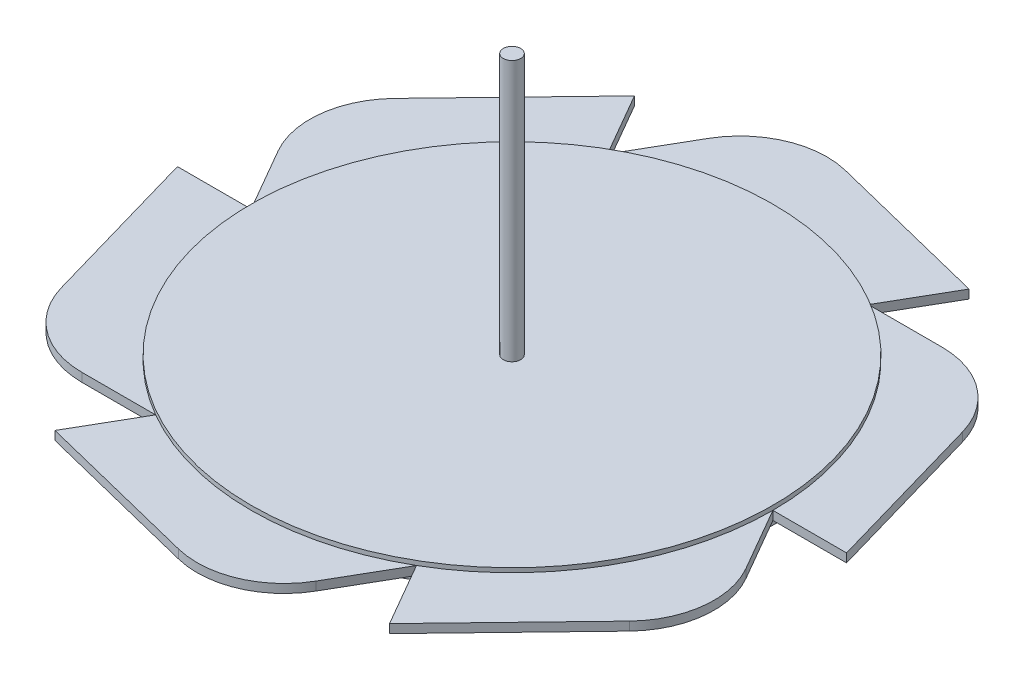
ISO-10303-21;
HEADER;
FILE_DESCRIPTION(('STEP AP214'),'2;1');
FILE_NAME('part.step','',(''),(''),'','','');
FILE_SCHEMA(('AUTOMOTIVE_DESIGN { 1 0 10303 214 1 1 1 1 }'));
ENDSEC;
DATA;
#1=APPLICATION_CONTEXT('core data for automotive mechanical design processes');
#2=APPLICATION_PROTOCOL_DEFINITION('international standard','automotive_design',2000,#1);
#3=PRODUCT_CONTEXT('',#1,'mechanical');
#4=PRODUCT('Part','Part','',(#3));
#5=PRODUCT_RELATED_PRODUCT_CATEGORY('part','',(#4));
#6=PRODUCT_DEFINITION_FORMATION('','',#4);
#7=PRODUCT_DEFINITION_CONTEXT('part definition',#1,'design');
#8=PRODUCT_DEFINITION('design','',#6,#7);
#9=PRODUCT_DEFINITION_SHAPE('','',#8);
#10=(LENGTH_UNIT() NAMED_UNIT(*) SI_UNIT(.MILLI.,.METRE.));
#11=(NAMED_UNIT(*) PLANE_ANGLE_UNIT() SI_UNIT($,.RADIAN.));
#12=(NAMED_UNIT(*) SI_UNIT($,.STERADIAN.) SOLID_ANGLE_UNIT());
#13=UNCERTAINTY_MEASURE_WITH_UNIT(LENGTH_MEASURE(1.E-05),#10,'distance_accuracy_value','');
#14=(GEOMETRIC_REPRESENTATION_CONTEXT(3) GLOBAL_UNCERTAINTY_ASSIGNED_CONTEXT((#13)) GLOBAL_UNIT_ASSIGNED_CONTEXT((#10,
#11,#12)) REPRESENTATION_CONTEXT('',''));
#15=CARTESIAN_POINT('',(0.,0.,0.));
#16=DIRECTION('',(0.,0.,1.));
#17=DIRECTION('',(1.,0.,0.));
#18=AXIS2_PLACEMENT_3D('',#15,#16,#17);
#19=CARTESIAN_POINT('',(0.,0.5,0.));
#20=DIRECTION('',(0.,-1.,0.));
#21=DIRECTION('',(0.,0.,-1.));
#22=AXIS2_PLACEMENT_3D('',#19,#20,#21);
#23=CYLINDRICAL_SURFACE('',#22,15.);
#24=CARTESIAN_POINT('',(0.,-0.5,0.));
#25=DIRECTION('',(0.,1.,0.));
#26=DIRECTION('',(0.,0.,1.));
#27=AXIS2_PLACEMENT_3D('',#24,#25,#26);
#28=CIRCLE('',#27,15.);
#29=CARTESIAN_POINT('',(0.,-0.5,15.));
#30=VERTEX_POINT('',#29);
#31=EDGE_CURVE('E137',#30,#30,#28,.T.);
#32=ORIENTED_EDGE('',*,*,#31,.T.);
#33=EDGE_LOOP('',(#32));
#34=FACE_BOUND('',#33,.T.);
#35=CARTESIAN_POINT('',(0.,-0.25,0.));
#36=DIRECTION('',(0.,1.,0.));
#37=DIRECTION('',(0.,0.,1.));
#38=AXIS2_PLACEMENT_3D('',#35,#36,#37);
#39=CIRCLE('',#38,15.);
#40=CARTESIAN_POINT('',(-7.50000000000011,-0.25,12.9903810567665));
#41=VERTEX_POINT('',#40);
#42=CARTESIAN_POINT('',(7.49999999999993,-0.25,12.9903810567666));
#43=VERTEX_POINT('',#42);
#44=EDGE_CURVE('E344',#41,#43,#39,.T.);
#45=ORIENTED_EDGE('',*,*,#44,.F.);
#46=CARTESIAN_POINT('',(0.,-0.25,0.));
#47=DIRECTION('',(0.,1.,0.));
#48=DIRECTION('',(0.,0.,1.));
#49=AXIS2_PLACEMENT_3D('',#46,#47,#48);
#50=CIRCLE('',#49,15.);
#51=CARTESIAN_POINT('',(-15.,-0.25,-1.67400815431762E-13));
#52=VERTEX_POINT('',#51);
#53=EDGE_CURVE('E512',#52,#41,#50,.T.);
#54=ORIENTED_EDGE('',*,*,#53,.F.);
#55=CARTESIAN_POINT('',(0.,-0.25,0.));
#56=DIRECTION('',(0.,1.,0.));
#57=DIRECTION('',(0.,0.,1.));
#58=AXIS2_PLACEMENT_3D('',#55,#56,#57);
#59=CIRCLE('',#58,15.);
#60=CARTESIAN_POINT('',(-7.50000000000002,-0.25,-12.9903810567666));
#61=VERTEX_POINT('',#60);
#62=EDGE_CURVE('E148',#61,#52,#59,.T.);
#63=ORIENTED_EDGE('',*,*,#62,.F.);
#64=CARTESIAN_POINT('',(0.,-0.25,0.));
#65=DIRECTION('',(0.,1.,0.));
#66=DIRECTION('',(0.,0.,1.));
#67=AXIS2_PLACEMENT_3D('',#64,#65,#66);
#68=CIRCLE('',#67,15.);
#69=CARTESIAN_POINT('',(7.50000000000002,-0.25,-12.9903810567666));
#70=VERTEX_POINT('',#69);
#71=EDGE_CURVE('E440',#70,#61,#68,.T.);
#72=ORIENTED_EDGE('',*,*,#71,.F.);
#73=CARTESIAN_POINT('',(0.,-0.25,0.));
#74=DIRECTION('',(0.,1.,0.));
#75=DIRECTION('',(0.,0.,1.));
#76=AXIS2_PLACEMENT_3D('',#73,#74,#75);
#77=CIRCLE('',#76,15.);
#78=CARTESIAN_POINT('',(15.,-0.25,0.));
#79=VERTEX_POINT('',#78);
#80=EDGE_CURVE('E403',#79,#70,#77,.T.);
#81=ORIENTED_EDGE('',*,*,#80,.F.);
#82=CARTESIAN_POINT('',(0.,-0.25,0.));
#83=DIRECTION('',(0.,1.,0.));
#84=DIRECTION('',(0.,0.,1.));
#85=AXIS2_PLACEMENT_3D('',#82,#83,#84);
#86=CIRCLE('',#85,15.);
#87=EDGE_CURVE('E366',#43,#79,#86,.T.);
#88=ORIENTED_EDGE('',*,*,#87,.F.);
#89=EDGE_LOOP('',(#45,#54,#63,#72,#81,#88));
#90=FACE_BOUND('',#89,.T.);
#91=ADVANCED_FACE('F133',(#34,#90),#23,.T.);
#92=CARTESIAN_POINT('',(0.,0.25,0.));
#93=DIRECTION('',(0.,1.,0.));
#94=DIRECTION('',(0.,0.,1.));
#95=AXIS2_PLACEMENT_3D('',#92,#93,#94);
#96=CIRCLE('',#95,15.);
#97=CARTESIAN_POINT('',(-15.,0.25,-1.60461921527855E-13));
#98=VERTEX_POINT('',#97);
#99=CARTESIAN_POINT('',(-7.50000000000011,0.25,12.9903810567665));
#100=VERTEX_POINT('',#99);
#101=EDGE_CURVE('E501',#98,#100,#96,.T.);
#102=ORIENTED_EDGE('',*,*,#101,.T.);
#103=CARTESIAN_POINT('',(0.,0.25,0.));
#104=DIRECTION('',(0.,1.,0.));
#105=DIRECTION('',(0.,0.,1.));
#106=AXIS2_PLACEMENT_3D('',#103,#104,#105);
#107=CIRCLE('',#106,15.);
#108=CARTESIAN_POINT('',(7.49999999999993,0.25,12.9903810567666));
#109=VERTEX_POINT('',#108);
#110=EDGE_CURVE('E313',#100,#109,#107,.T.);
#111=ORIENTED_EDGE('',*,*,#110,.T.);
#112=CARTESIAN_POINT('',(0.,0.25,0.));
#113=DIRECTION('',(0.,1.,0.));
#114=DIRECTION('',(0.,0.,1.));
#115=AXIS2_PLACEMENT_3D('',#112,#113,#114);
#116=CIRCLE('',#115,15.);
#117=CARTESIAN_POINT('',(15.,0.25,0.));
#118=VERTEX_POINT('',#117);
#119=EDGE_CURVE('E353',#109,#118,#116,.T.);
#120=ORIENTED_EDGE('',*,*,#119,.T.);
#121=CARTESIAN_POINT('',(0.,0.25,0.));
#122=DIRECTION('',(0.,1.,0.));
#123=DIRECTION('',(0.,0.,1.));
#124=AXIS2_PLACEMENT_3D('',#121,#122,#123);
#125=CIRCLE('',#124,15.);
#126=CARTESIAN_POINT('',(7.50000000000002,0.25,-12.9903810567666));
#127=VERTEX_POINT('',#126);
#128=EDGE_CURVE('E388',#118,#127,#125,.T.);
#129=ORIENTED_EDGE('',*,*,#128,.T.);
#130=CARTESIAN_POINT('',(0.,0.25,0.));
#131=DIRECTION('',(0.,1.,0.));
#132=DIRECTION('',(0.,0.,1.));
#133=AXIS2_PLACEMENT_3D('',#130,#131,#132);
#134=CIRCLE('',#133,15.);
#135=CARTESIAN_POINT('',(-7.50000000000002,0.25,-12.9903810567666));
#136=VERTEX_POINT('',#135);
#137=EDGE_CURVE('E425',#127,#136,#134,.T.);
#138=ORIENTED_EDGE('',*,*,#137,.T.);
#139=CARTESIAN_POINT('',(0.,0.25,0.));
#140=DIRECTION('',(0.,1.,0.));
#141=DIRECTION('',(0.,0.,1.));
#142=AXIS2_PLACEMENT_3D('',#139,#140,#141);
#143=CIRCLE('',#142,15.);
#144=EDGE_CURVE('E462',#136,#98,#143,.T.);
#145=ORIENTED_EDGE('',*,*,#144,.T.);
#146=EDGE_LOOP('',(#102,#111,#120,#129,#138,#145));
#147=FACE_BOUND('',#146,.T.);
#148=CARTESIAN_POINT('',(0.,0.5,0.));
#149=DIRECTION('',(0.,1.,0.));
#150=DIRECTION('',(0.,0.,1.));
#151=AXIS2_PLACEMENT_3D('',#148,#149,#150);
#152=CIRCLE('',#151,15.);
#153=CARTESIAN_POINT('',(0.,0.5,15.));
#154=VERTEX_POINT('',#153);
#155=EDGE_CURVE('E12',#154,#154,#152,.T.);
#156=ORIENTED_EDGE('',*,*,#155,.F.);
#157=EDGE_LOOP('',(#156));
#158=FACE_BOUND('',#157,.T.);
#159=ADVANCED_FACE('F135',(#147,#158),#23,.T.);
#160=CARTESIAN_POINT('',(0.,0.5,0.));
#161=DIRECTION('',(0.,1.,0.));
#162=DIRECTION('',(0.,0.,1.));
#163=AXIS2_PLACEMENT_3D('',#160,#161,#162);
#164=PLANE('',#163);
#165=CARTESIAN_POINT('',(0.,0.5,0.));
#166=DIRECTION('',(0.,1.,0.));
#167=DIRECTION('',(0.,0.,1.));
#168=AXIS2_PLACEMENT_3D('',#165,#166,#167);
#169=CIRCLE('',#168,0.5);
#170=CARTESIAN_POINT('',(0.,0.5,0.5));
#171=VERTEX_POINT('',#170);
#172=EDGE_CURVE('E931',#171,#171,#169,.T.);
#173=ORIENTED_EDGE('',*,*,#172,.F.);
#174=EDGE_LOOP('',(#173));
#175=FACE_BOUND('',#174,.T.);
#176=ORIENTED_EDGE('',*,*,#155,.T.);
#177=EDGE_LOOP('',(#176));
#178=FACE_BOUND('',#177,.T.);
#179=ADVANCED_FACE('F538',(#175,#178),#164,.T.);
#180=CARTESIAN_POINT('',(0.,-0.5,0.));
#181=DIRECTION('',(0.,1.,0.));
#182=DIRECTION('',(0.,0.,1.));
#183=AXIS2_PLACEMENT_3D('',#180,#181,#182);
#184=PLANE('',#183);
#185=ORIENTED_EDGE('',*,*,#31,.F.);
#186=EDGE_LOOP('',(#185));
#187=FACE_BOUND('',#186,.T.);
#188=ADVANCED_FACE('F535',(#187),#184,.F.);
#189=CARTESIAN_POINT('',(-11.7350492004007,0.25,7.99038105676649));
#190=DIRECTION('',(0.,-1.,0.));
#191=DIRECTION('',(0.,0.,-1.));
#192=AXIS2_PLACEMENT_3D('',#189,#190,#191);
#193=CYLINDRICAL_SURFACE('',#192,5.);
#194=CARTESIAN_POINT('',(-11.7350492004007,-0.25,7.99038105676649));
#195=DIRECTION('',(0.,1.,0.));
#196=DIRECTION('',(0.,0.,1.));
#197=AXIS2_PLACEMENT_3D('',#194,#195,#196);
#198=CIRCLE('',#197,5.);
#199=CARTESIAN_POINT('',(-11.7350492004007,-0.25,12.9903810567665));
#200=VERTEX_POINT('',#199);
#201=CARTESIAN_POINT('',(-16.5403648108902,-0.25,9.37202568675845));
#202=VERTEX_POINT('',#201);
#203=EDGE_CURVE('E483',#200,#202,#198,.F.);
#204=ORIENTED_EDGE('',*,*,#203,.F.);
#205=DIRECTION('',(0.,-1.,0.));
#206=VECTOR('',#205,1.);
#207=CARTESIAN_POINT('',(-11.7350492004007,0.25,12.9903810567665));
#208=LINE('',#207,#206);
#209=CARTESIAN_POINT('',(-11.7350492004007,0.25,12.9903810567665));
#210=VERTEX_POINT('',#209);
#211=EDGE_CURVE('E175',#210,#200,#208,.T.);
#212=ORIENTED_EDGE('',*,*,#211,.F.);
#213=CARTESIAN_POINT('',(-11.7350492004007,0.25,7.99038105676649));
#214=DIRECTION('',(0.,1.,0.));
#215=DIRECTION('',(0.,0.,1.));
#216=AXIS2_PLACEMENT_3D('',#213,#214,#215);
#217=CIRCLE('',#216,5.);
#218=CARTESIAN_POINT('',(-16.5403648108902,0.25,9.37202568675845));
#219=VERTEX_POINT('',#218);
#220=EDGE_CURVE('E495',#210,#219,#217,.F.);
#221=ORIENTED_EDGE('',*,*,#220,.T.);
#222=DIRECTION('',(0.,-1.,0.));
#223=VECTOR('',#222,1.);
#224=CARTESIAN_POINT('',(-16.5403648108902,0.25,9.37202568675845));
#225=LINE('',#224,#223);
#226=EDGE_CURVE('E157',#219,#202,#225,.T.);
#227=ORIENTED_EDGE('',*,*,#226,.T.);
#228=EDGE_LOOP('',(#204,#212,#221,#227));
#229=FACE_BOUND('',#228,.T.);
#230=ADVANCED_FACE('F537',(#229),#193,.T.);
#231=CARTESIAN_POINT('',(0.,0.25,12.9903810567666));
#232=DIRECTION('',(0.,0.,1.));
#233=DIRECTION('',(1.,0.,0.));
#234=AXIS2_PLACEMENT_3D('',#231,#232,#233);
#235=PLANE('',#234);
#236=DIRECTION('',(-1.,0.,0.));
#237=VECTOR('',#236,1.);
#238=CARTESIAN_POINT('',(0.,-0.25,12.9903810567666));
#239=LINE('',#238,#237);
#240=EDGE_CURVE('E509',#41,#200,#239,.T.);
#241=ORIENTED_EDGE('',*,*,#240,.F.);
#242=DIRECTION('',(0.,-1.,0.));
#243=VECTOR('',#242,1.);
#244=CARTESIAN_POINT('',(-7.50000000000011,0.25,12.9903810567665));
#245=LINE('',#244,#243);
#246=EDGE_CURVE('E526',#100,#41,#245,.T.);
#247=ORIENTED_EDGE('',*,*,#246,.F.);
#248=DIRECTION('',(-1.,0.,0.));
#249=VECTOR('',#248,1.);
#250=CARTESIAN_POINT('',(0.,0.25,12.9903810567666));
#251=LINE('',#250,#249);
#252=EDGE_CURVE('E497',#100,#210,#251,.T.);
#253=ORIENTED_EDGE('',*,*,#252,.T.);
#254=ORIENTED_EDGE('',*,*,#211,.T.);
#255=EDGE_LOOP('',(#241,#247,#253,#254));
#256=FACE_BOUND('',#255,.T.);
#257=ADVANCED_FACE('F543',(#256),#235,.T.);
#258=CARTESIAN_POINT('',(0.,0.25,-1.08236496811154E-13));
#259=DIRECTION('',(0.,0.,1.));
#260=DIRECTION('',(1.,0.,0.));
#261=AXIS2_PLACEMENT_3D('',#258,#259,#260);
#262=PLANE('',#261);
#263=DIRECTION('',(-1.,0.,0.));
#264=VECTOR('',#263,1.);
#265=CARTESIAN_POINT('',(0.,-0.25,-1.08236496811154E-13));
#266=LINE('',#265,#264);
#267=CARTESIAN_POINT('',(-19.2350492004006,-0.25,-1.74339709335669E-13));
#268=VERTEX_POINT('',#267);
#269=EDGE_CURVE('E515',#52,#268,#266,.T.);
#270=ORIENTED_EDGE('',*,*,#269,.T.);
#271=DIRECTION('',(0.,-1.,0.));
#272=VECTOR('',#271,1.);
#273=CARTESIAN_POINT('',(-19.2350492004006,0.25,-1.74339709335669E-13));
#274=LINE('',#273,#272);
#275=CARTESIAN_POINT('',(-19.2350492004006,0.25,-1.74339709335669E-13));
#276=VERTEX_POINT('',#275);
#277=EDGE_CURVE('E521',#276,#268,#274,.T.);
#278=ORIENTED_EDGE('',*,*,#277,.F.);
#279=DIRECTION('',(-1.,0.,0.));
#280=VECTOR('',#279,1.);
#281=CARTESIAN_POINT('',(0.,0.25,-1.08236496811154E-13));
#282=LINE('',#281,#280);
#283=EDGE_CURVE('E504',#98,#276,#282,.T.);
#284=ORIENTED_EDGE('',*,*,#283,.F.);
#285=DIRECTION('',(0.,-1.,0.));
#286=VECTOR('',#285,1.);
#287=CARTESIAN_POINT('',(-15.,0.25,-1.60461921527855E-13));
#288=LINE('',#287,#286);
#289=EDGE_CURVE('E523',#98,#52,#288,.T.);
#290=ORIENTED_EDGE('',*,*,#289,.T.);
#291=EDGE_LOOP('',(#270,#278,#284,#290));
#292=FACE_BOUND('',#291,.T.);
#293=ADVANCED_FACE('F576',(#292),#262,.F.);
#294=CARTESIAN_POINT('',(-17.7663055583416,0.25,5.10824317468259));
#295=DIRECTION('',(-0.961063122097906,0.,0.276328925998391));
#296=DIRECTION('',(0.276328925998391,0.,0.961063122097907));
#297=AXIS2_PLACEMENT_3D('',#294,#295,#296);
#298=PLANE('',#297);
#299=DIRECTION('',(-0.276328925998391,0.,-0.961063122097907));
#300=VECTOR('',#299,1.);
#301=CARTESIAN_POINT('',(-17.7663055583416,-0.25,5.10824317468259));
#302=LINE('',#301,#300);
#303=EDGE_CURVE('E498',#202,#268,#302,.T.);
#304=ORIENTED_EDGE('',*,*,#303,.F.);
#305=ORIENTED_EDGE('',*,*,#226,.F.);
#306=DIRECTION('',(-0.276328925998391,0.,-0.961063122097907));
#307=VECTOR('',#306,1.);
#308=CARTESIAN_POINT('',(-17.7663055583416,0.25,5.10824317468259));
#309=LINE('',#308,#307);
#310=EDGE_CURVE('E506',#219,#276,#309,.T.);
#311=ORIENTED_EDGE('',*,*,#310,.T.);
#312=ORIENTED_EDGE('',*,*,#277,.T.);
#313=EDGE_LOOP('',(#304,#305,#311,#312));
#314=FACE_BOUND('',#313,.T.);
#315=ADVANCED_FACE('F607',(#314),#298,.T.);
#316=CARTESIAN_POINT('',(0.,0.25,0.));
#317=DIRECTION('',(0.,1.,0.));
#318=DIRECTION('',(0.,0.,1.));
#319=AXIS2_PLACEMENT_3D('',#316,#317,#318);
#320=PLANE('',#319);
#321=ORIENTED_EDGE('',*,*,#220,.F.);
#322=ORIENTED_EDGE('',*,*,#252,.F.);
#323=ORIENTED_EDGE('',*,*,#101,.F.);
#324=ORIENTED_EDGE('',*,*,#283,.T.);
#325=ORIENTED_EDGE('',*,*,#310,.F.);
#326=EDGE_LOOP('',(#321,#322,#323,#324,#325));
#327=FACE_BOUND('',#326,.T.);
#328=ADVANCED_FACE('F566',(#327),#320,.T.);
#329=CARTESIAN_POINT('',(0.,-0.25,0.));
#330=DIRECTION('',(0.,1.,0.));
#331=DIRECTION('',(0.,0.,1.));
#332=AXIS2_PLACEMENT_3D('',#329,#330,#331);
#333=PLANE('',#332);
#334=ORIENTED_EDGE('',*,*,#203,.T.);
#335=ORIENTED_EDGE('',*,*,#303,.T.);
#336=ORIENTED_EDGE('',*,*,#269,.F.);
#337=ORIENTED_EDGE('',*,*,#53,.T.);
#338=ORIENTED_EDGE('',*,*,#240,.T.);
#339=EDGE_LOOP('',(#334,#335,#336,#337,#338));
#340=FACE_BOUND('',#339,.T.);
#341=ADVANCED_FACE('F569',(#340),#333,.F.);
#342=CARTESIAN_POINT('',(-12.787397581278,0.25,-6.16766019382403));
#343=DIRECTION('',(0.,-1.,0.));
#344=DIRECTION('',(0.,0.,-1.));
#345=AXIS2_PLACEMENT_3D('',#342,#343,#344);
#346=CYLINDRICAL_SURFACE('',#345,5.);
#347=CARTESIAN_POINT('',(-12.787397581278,-0.25,-6.16766019382403));
#348=DIRECTION('',(0.,1.,0.));
#349=DIRECTION('',(0.,0.,1.));
#350=AXIS2_PLACEMENT_3D('',#347,#348,#349);
#351=CIRCLE('',#350,5.);
#352=CARTESIAN_POINT('',(-17.1175246002003,-0.25,-3.66766019382407));
#353=VERTEX_POINT('',#352);
#354=CARTESIAN_POINT('',(-16.3865947350982,-0.25,-9.63836327071393));
#355=VERTEX_POINT('',#354);
#356=EDGE_CURVE('E477',#353,#355,#351,.F.);
#357=ORIENTED_EDGE('',*,*,#356,.F.);
#358=DIRECTION('',(0.,-1.,0.));
#359=VECTOR('',#358,1.);
#360=CARTESIAN_POINT('',(-17.1175246002003,0.25,-3.66766019382407));
#361=LINE('',#360,#359);
#362=CARTESIAN_POINT('',(-17.1175246002003,0.25,-3.66766019382407));
#363=VERTEX_POINT('',#362);
#364=EDGE_CURVE('E460',#363,#353,#361,.T.);
#365=ORIENTED_EDGE('',*,*,#364,.F.);
#366=CARTESIAN_POINT('',(-12.787397581278,0.25,-6.16766019382403));
#367=DIRECTION('',(0.,1.,0.));
#368=DIRECTION('',(0.,0.,1.));
#369=AXIS2_PLACEMENT_3D('',#366,#367,#368);
#370=CIRCLE('',#369,5.);
#371=CARTESIAN_POINT('',(-16.3865947350982,0.25,-9.63836327071393));
#372=VERTEX_POINT('',#371);
#373=EDGE_CURVE('E448',#363,#372,#370,.F.);
#374=ORIENTED_EDGE('',*,*,#373,.T.);
#375=DIRECTION('',(0.,-1.,0.));
#376=VECTOR('',#375,1.);
#377=CARTESIAN_POINT('',(-16.3865947350982,0.25,-9.63836327071393));
#378=LINE('',#377,#376);
#379=EDGE_CURVE('E472',#372,#355,#378,.T.);
#380=ORIENTED_EDGE('',*,*,#379,.T.);
#381=EDGE_LOOP('',(#357,#365,#374,#380));
#382=FACE_BOUND('',#381,.T.);
#383=ADVANCED_FACE('F587',(#382),#346,.T.);
#384=CARTESIAN_POINT('',(-11.25,0.25,6.49519052838319));
#385=DIRECTION('',(-0.866025403784442,0.,0.499999999999994));
#386=DIRECTION('',(0.499999999999994,0.,0.866025403784442));
#387=AXIS2_PLACEMENT_3D('',#384,#385,#386);
#388=PLANE('',#387);
#389=DIRECTION('',(-0.499999999999994,0.,-0.866025403784442));
#390=VECTOR('',#389,1.);
#391=CARTESIAN_POINT('',(-11.25,-0.25,6.49519052838319));
#392=LINE('',#391,#390);
#393=EDGE_CURVE('E481',#52,#353,#392,.T.);
#394=ORIENTED_EDGE('',*,*,#393,.F.);
#395=ORIENTED_EDGE('',*,*,#289,.F.);
#396=DIRECTION('',(-0.499999999999994,0.,-0.866025403784442));
#397=VECTOR('',#396,1.);
#398=CARTESIAN_POINT('',(-11.25,0.25,6.49519052838319));
#399=LINE('',#398,#397);
#400=EDGE_CURVE('E463',#98,#363,#399,.T.);
#401=ORIENTED_EDGE('',*,*,#400,.T.);
#402=ORIENTED_EDGE('',*,*,#364,.T.);
#403=EDGE_LOOP('',(#394,#395,#401,#402));
#404=FACE_BOUND('',#403,.T.);
#405=ADVANCED_FACE('F580',(#404),#388,.T.);
#406=CARTESIAN_POINT('',(0.,0.25,0.));
#407=DIRECTION('',(-0.866025403784442,0.,0.499999999999995));
#408=DIRECTION('',(0.499999999999995,0.,0.866025403784442));
#409=AXIS2_PLACEMENT_3D('',#406,#407,#408);
#410=PLANE('',#409);
#411=DIRECTION('',(-0.499999999999994,0.,-0.866025403784442));
#412=VECTOR('',#411,1.);
#413=CARTESIAN_POINT('',(0.,-0.25,0.));
#414=LINE('',#413,#412);
#415=CARTESIAN_POINT('',(-9.61752460020011,-0.25,-16.6580412505906));
#416=VERTEX_POINT('',#415);
#417=EDGE_CURVE('E468',#61,#416,#414,.T.);
#418=ORIENTED_EDGE('',*,*,#417,.T.);
#419=DIRECTION('',(0.,-1.,0.));
#420=VECTOR('',#419,1.);
#421=CARTESIAN_POINT('',(-9.61752460020011,0.25,-16.6580412505906));
#422=LINE('',#421,#420);
#423=CARTESIAN_POINT('',(-9.61752460020011,0.25,-16.6580412505906));
#424=VERTEX_POINT('',#423);
#425=EDGE_CURVE('E469',#424,#416,#422,.T.);
#426=ORIENTED_EDGE('',*,*,#425,.F.);
#427=DIRECTION('',(-0.499999999999994,0.,-0.866025403784442));
#428=VECTOR('',#427,1.);
#429=CARTESIAN_POINT('',(0.,0.25,0.));
#430=LINE('',#429,#428);
#431=EDGE_CURVE('E471',#136,#424,#430,.T.);
#432=ORIENTED_EDGE('',*,*,#431,.F.);
#433=DIRECTION('',(0.,-1.,0.));
#434=VECTOR('',#433,1.);
#435=CARTESIAN_POINT('',(-7.50000000000002,0.25,-12.9903810567666));
#436=LINE('',#435,#434);
#437=EDGE_CURVE('E464',#136,#61,#436,.T.);
#438=ORIENTED_EDGE('',*,*,#437,.T.);
#439=EDGE_LOOP('',(#418,#426,#432,#438));
#440=FACE_BOUND('',#439,.T.);
#441=ADVANCED_FACE('F653',(#440),#410,.F.);
#442=CARTESIAN_POINT('',(-13.3070211371543,0.25,-12.8319503575792));
#443=DIRECTION('',(-0.719839430764029,0.,-0.694140615377979));
#444=DIRECTION('',(-0.694140615377979,0.,0.719839430764029));
#445=AXIS2_PLACEMENT_3D('',#442,#443,#444);
#446=PLANE('',#445);
#447=DIRECTION('',(0.694140615377979,0.,-0.719839430764029));
#448=VECTOR('',#447,1.);
#449=CARTESIAN_POINT('',(-13.3070211371543,-0.25,-12.8319503575792));
#450=LINE('',#449,#448);
#451=EDGE_CURVE('E474',#355,#416,#450,.T.);
#452=ORIENTED_EDGE('',*,*,#451,.F.);
#453=ORIENTED_EDGE('',*,*,#379,.F.);
#454=DIRECTION('',(0.694140615377979,0.,-0.719839430764029));
#455=VECTOR('',#454,1.);
#456=CARTESIAN_POINT('',(-13.3070211371543,0.25,-12.8319503575792));
#457=LINE('',#456,#455);
#458=EDGE_CURVE('E467',#372,#424,#457,.T.);
#459=ORIENTED_EDGE('',*,*,#458,.T.);
#460=ORIENTED_EDGE('',*,*,#425,.T.);
#461=EDGE_LOOP('',(#452,#453,#459,#460));
#462=FACE_BOUND('',#461,.T.);
#463=ADVANCED_FACE('F600',(#462),#446,.T.);
#464=CARTESIAN_POINT('',(0.,0.25,0.));
#465=DIRECTION('',(0.,1.,0.));
#466=DIRECTION('',(0.,0.,1.));
#467=AXIS2_PLACEMENT_3D('',#464,#465,#466);
#468=PLANE('',#467);
#469=ORIENTED_EDGE('',*,*,#373,.F.);
#470=ORIENTED_EDGE('',*,*,#400,.F.);
#471=ORIENTED_EDGE('',*,*,#144,.F.);
#472=ORIENTED_EDGE('',*,*,#431,.T.);
#473=ORIENTED_EDGE('',*,*,#458,.F.);
#474=EDGE_LOOP('',(#469,#470,#471,#472,#473));
#475=FACE_BOUND('',#474,.T.);
#476=ADVANCED_FACE('F583',(#475),#468,.T.);
#477=CARTESIAN_POINT('',(0.,-0.25,0.));
#478=DIRECTION('',(0.,1.,0.));
#479=DIRECTION('',(0.,0.,1.));
#480=AXIS2_PLACEMENT_3D('',#477,#478,#479);
#481=PLANE('',#480);
#482=ORIENTED_EDGE('',*,*,#356,.T.);
#483=ORIENTED_EDGE('',*,*,#451,.T.);
#484=ORIENTED_EDGE('',*,*,#417,.F.);
#485=ORIENTED_EDGE('',*,*,#62,.T.);
#486=ORIENTED_EDGE('',*,*,#393,.T.);
#487=EDGE_LOOP('',(#482,#483,#484,#485,#486));
#488=FACE_BOUND('',#487,.T.);
#489=ADVANCED_FACE('F589',(#488),#481,.F.);
#490=CARTESIAN_POINT('',(-1.05234838087752,0.25,-14.1580412505905));
#491=DIRECTION('',(0.,-1.,0.));
#492=DIRECTION('',(0.,0.,-1.));
#493=AXIS2_PLACEMENT_3D('',#490,#491,#492);
#494=CYLINDRICAL_SURFACE('',#493,5.);
#495=CARTESIAN_POINT('',(-1.05234838087752,-0.25,-14.1580412505905));
#496=DIRECTION('',(0.,1.,0.));
#497=DIRECTION('',(0.,0.,1.));
#498=AXIS2_PLACEMENT_3D('',#495,#496,#497);
#499=CIRCLE('',#498,5.);
#500=CARTESIAN_POINT('',(-5.38247539979972,-0.25,-16.6580412505905));
#501=VERTEX_POINT('',#500);
#502=CARTESIAN_POINT('',(0.153770075791809,-0.25,-19.0103889574723));
#503=VERTEX_POINT('',#502);
#504=EDGE_CURVE('E441',#501,#503,#499,.F.);
#505=ORIENTED_EDGE('',*,*,#504,.F.);
#506=DIRECTION('',(0.,-1.,0.));
#507=VECTOR('',#506,1.);
#508=CARTESIAN_POINT('',(-5.38247539979972,0.25,-16.6580412505905));
#509=LINE('',#508,#507);
#510=CARTESIAN_POINT('',(-5.38247539979972,0.25,-16.6580412505905));
#511=VERTEX_POINT('',#510);
#512=EDGE_CURVE('E423',#511,#501,#509,.T.);
#513=ORIENTED_EDGE('',*,*,#512,.F.);
#514=CARTESIAN_POINT('',(-1.05234838087752,0.25,-14.1580412505905));
#515=DIRECTION('',(0.,1.,0.));
#516=DIRECTION('',(0.,0.,1.));
#517=AXIS2_PLACEMENT_3D('',#514,#515,#516);
#518=CIRCLE('',#517,5.);
#519=CARTESIAN_POINT('',(0.153770075791809,0.25,-19.0103889574723));
#520=VERTEX_POINT('',#519);
#521=EDGE_CURVE('E411',#511,#520,#518,.F.);
#522=ORIENTED_EDGE('',*,*,#521,.T.);
#523=DIRECTION('',(0.,-1.,0.));
#524=VECTOR('',#523,1.);
#525=CARTESIAN_POINT('',(0.153770075791809,0.25,-19.0103889574723));
#526=LINE('',#525,#524);
#527=EDGE_CURVE('E435',#520,#503,#526,.T.);
#528=ORIENTED_EDGE('',*,*,#527,.T.);
#529=EDGE_LOOP('',(#505,#513,#522,#528));
#530=FACE_BOUND('',#529,.T.);
#531=ADVANCED_FACE('F591',(#530),#494,.T.);
#532=CARTESIAN_POINT('',(-11.25,0.25,-6.49519052838327));
#533=DIRECTION('',(-0.866025403784439,0.,-0.499999999999999));
#534=DIRECTION('',(-0.499999999999999,0.,0.866025403784439));
#535=AXIS2_PLACEMENT_3D('',#532,#533,#534);
#536=PLANE('',#535);
#537=DIRECTION('',(0.499999999999999,0.,-0.86602540378444));
#538=VECTOR('',#537,1.);
#539=CARTESIAN_POINT('',(-11.25,-0.25,-6.49519052838327));
#540=LINE('',#539,#538);
#541=EDGE_CURVE('E445',#61,#501,#540,.T.);
#542=ORIENTED_EDGE('',*,*,#541,.F.);
#543=ORIENTED_EDGE('',*,*,#437,.F.);
#544=DIRECTION('',(0.499999999999999,0.,-0.86602540378444));
#545=VECTOR('',#544,1.);
#546=CARTESIAN_POINT('',(-11.25,0.25,-6.49519052838327));
#547=LINE('',#546,#545);
#548=EDGE_CURVE('E426',#136,#511,#547,.T.);
#549=ORIENTED_EDGE('',*,*,#548,.T.);
#550=ORIENTED_EDGE('',*,*,#512,.T.);
#551=EDGE_LOOP('',(#542,#543,#549,#550));
#552=FACE_BOUND('',#551,.T.);
#553=ADVANCED_FACE('F597',(#552),#536,.T.);
#554=CARTESIAN_POINT('',(0.,0.25,0.));
#555=DIRECTION('',(-0.866025403784441,0.,-0.499999999999995));
#556=DIRECTION('',(-0.499999999999995,0.,0.866025403784442));
#557=AXIS2_PLACEMENT_3D('',#554,#555,#556);
#558=PLANE('',#557);
#559=DIRECTION('',(0.499999999999995,0.,-0.866025403784441));
#560=VECTOR('',#559,1.);
#561=CARTESIAN_POINT('',(0.,-0.25,0.));
#562=LINE('',#561,#560);
#563=CARTESIAN_POINT('',(9.6175246002003,-0.25,-16.6580412505905));
#564=VERTEX_POINT('',#563);
#565=EDGE_CURVE('E431',#70,#564,#562,.T.);
#566=ORIENTED_EDGE('',*,*,#565,.T.);
#567=DIRECTION('',(0.,-1.,0.));
#568=VECTOR('',#567,1.);
#569=CARTESIAN_POINT('',(9.6175246002003,0.25,-16.6580412505905));
#570=LINE('',#569,#568);
#571=CARTESIAN_POINT('',(9.6175246002003,0.25,-16.6580412505905));
#572=VERTEX_POINT('',#571);
#573=EDGE_CURVE('E432',#572,#564,#570,.T.);
#574=ORIENTED_EDGE('',*,*,#573,.F.);
#575=DIRECTION('',(0.499999999999995,0.,-0.866025403784441));
#576=VECTOR('',#575,1.);
#577=CARTESIAN_POINT('',(0.,0.25,0.));
#578=LINE('',#577,#576);
#579=EDGE_CURVE('E434',#127,#572,#578,.T.);
#580=ORIENTED_EDGE('',*,*,#579,.F.);
#581=DIRECTION('',(0.,-1.,0.));
#582=VECTOR('',#581,1.);
#583=CARTESIAN_POINT('',(7.50000000000002,0.25,-12.9903810567666));
#584=LINE('',#583,#582);
#585=EDGE_CURVE('E427',#127,#70,#584,.T.);
#586=ORIENTED_EDGE('',*,*,#585,.T.);
#587=EDGE_LOOP('',(#566,#574,#580,#586));
#588=FACE_BOUND('',#587,.T.);
#589=ADVANCED_FACE('F693',(#588),#558,.F.);
#590=CARTESIAN_POINT('',(4.45928442118702,0.25,-17.9401935322618));
#591=DIRECTION('',(0.241223691333867,0.,-0.970469541376371));
#592=DIRECTION('',(-0.970469541376371,0.,-0.241223691333867));
#593=AXIS2_PLACEMENT_3D('',#590,#591,#592);
#594=PLANE('',#593);
#595=DIRECTION('',(0.970469541376371,0.,0.241223691333867));
#596=VECTOR('',#595,1.);
#597=CARTESIAN_POINT('',(4.45928442118702,-0.25,-17.9401935322618));
#598=LINE('',#597,#596);
#599=EDGE_CURVE('E437',#503,#564,#598,.T.);
#600=ORIENTED_EDGE('',*,*,#599,.F.);
#601=ORIENTED_EDGE('',*,*,#527,.F.);
#602=DIRECTION('',(0.970469541376371,0.,0.241223691333867));
#603=VECTOR('',#602,1.);
#604=CARTESIAN_POINT('',(4.45928442118702,0.25,-17.9401935322618));
#605=LINE('',#604,#603);
#606=EDGE_CURVE('E430',#520,#572,#605,.T.);
#607=ORIENTED_EDGE('',*,*,#606,.T.);
#608=ORIENTED_EDGE('',*,*,#573,.T.);
#609=EDGE_LOOP('',(#600,#601,#607,#608));
#610=FACE_BOUND('',#609,.T.);
#611=ADVANCED_FACE('F703',(#610),#594,.T.);
#612=CARTESIAN_POINT('',(0.,0.25,0.));
#613=DIRECTION('',(0.,1.,0.));
#614=DIRECTION('',(0.,0.,1.));
#615=AXIS2_PLACEMENT_3D('',#612,#613,#614);
#616=PLANE('',#615);
#617=ORIENTED_EDGE('',*,*,#521,.F.);
#618=ORIENTED_EDGE('',*,*,#548,.F.);
#619=ORIENTED_EDGE('',*,*,#137,.F.);
#620=ORIENTED_EDGE('',*,*,#579,.T.);
#621=ORIENTED_EDGE('',*,*,#606,.F.);
#622=EDGE_LOOP('',(#617,#618,#619,#620,#621));
#623=FACE_BOUND('',#622,.T.);
#624=ADVANCED_FACE('F713',(#623),#616,.T.);
#625=CARTESIAN_POINT('',(0.,-0.25,0.));
#626=DIRECTION('',(0.,1.,0.));
#627=DIRECTION('',(0.,0.,1.));
#628=AXIS2_PLACEMENT_3D('',#625,#626,#627);
#629=PLANE('',#628);
#630=ORIENTED_EDGE('',*,*,#504,.T.);
#631=ORIENTED_EDGE('',*,*,#599,.T.);
#632=ORIENTED_EDGE('',*,*,#565,.F.);
#633=ORIENTED_EDGE('',*,*,#71,.T.);
#634=ORIENTED_EDGE('',*,*,#541,.T.);
#635=EDGE_LOOP('',(#630,#631,#632,#633,#634));
#636=FACE_BOUND('',#635,.T.);
#637=ADVANCED_FACE('F723',(#636),#629,.F.);
#638=CARTESIAN_POINT('',(11.7350492004006,0.25,-7.99038105676657));
#639=DIRECTION('',(0.,-1.,0.));
#640=DIRECTION('',(0.,0.,-1.));
#641=AXIS2_PLACEMENT_3D('',#638,#639,#640);
#642=CYLINDRICAL_SURFACE('',#641,5.);
#643=CARTESIAN_POINT('',(11.7350492004006,-0.25,-7.99038105676657));
#644=DIRECTION('',(0.,1.,0.));
#645=DIRECTION('',(0.,0.,1.));
#646=AXIS2_PLACEMENT_3D('',#643,#644,#645);
#647=CIRCLE('',#646,5.);
#648=CARTESIAN_POINT('',(11.7350492004006,-0.25,-12.9903810567666));
#649=VERTEX_POINT('',#648);
#650=CARTESIAN_POINT('',(16.5403648108901,-0.25,-9.37202568675857));
#651=VERTEX_POINT('',#650);
#652=EDGE_CURVE('E404',#649,#651,#647,.F.);
#653=ORIENTED_EDGE('',*,*,#652,.F.);
#654=DIRECTION('',(0.,-1.,0.));
#655=VECTOR('',#654,1.);
#656=CARTESIAN_POINT('',(11.7350492004006,0.25,-12.9903810567666));
#657=LINE('',#656,#655);
#658=CARTESIAN_POINT('',(11.7350492004006,0.25,-12.9903810567666));
#659=VERTEX_POINT('',#658);
#660=EDGE_CURVE('E386',#659,#649,#657,.T.);
#661=ORIENTED_EDGE('',*,*,#660,.F.);
#662=CARTESIAN_POINT('',(11.7350492004006,0.25,-7.99038105676657));
#663=DIRECTION('',(0.,1.,0.));
#664=DIRECTION('',(0.,0.,1.));
#665=AXIS2_PLACEMENT_3D('',#662,#663,#664);
#666=CIRCLE('',#665,5.);
#667=CARTESIAN_POINT('',(16.5403648108901,0.25,-9.37202568675857));
#668=VERTEX_POINT('',#667);
#669=EDGE_CURVE('E374',#659,#668,#666,.F.);
#670=ORIENTED_EDGE('',*,*,#669,.T.);
#671=DIRECTION('',(0.,-1.,0.));
#672=VECTOR('',#671,1.);
#673=CARTESIAN_POINT('',(16.5403648108901,0.25,-9.37202568675857));
#674=LINE('',#673,#672);
#675=EDGE_CURVE('E398',#668,#651,#674,.T.);
#676=ORIENTED_EDGE('',*,*,#675,.T.);
#677=EDGE_LOOP('',(#653,#661,#670,#676));
#678=FACE_BOUND('',#677,.T.);
#679=ADVANCED_FACE('F733',(#678),#642,.T.);
#680=CARTESIAN_POINT('',(0.,0.25,-12.9903810567666));
#681=DIRECTION('',(0.,0.,-1.));
#682=DIRECTION('',(-1.,0.,0.));
#683=AXIS2_PLACEMENT_3D('',#680,#681,#682);
#684=PLANE('',#683);
#685=DIRECTION('',(1.,0.,0.));
#686=VECTOR('',#685,1.);
#687=CARTESIAN_POINT('',(0.,-0.25,-12.9903810567666));
#688=LINE('',#687,#686);
#689=EDGE_CURVE('E408',#70,#649,#688,.T.);
#690=ORIENTED_EDGE('',*,*,#689,.F.);
#691=ORIENTED_EDGE('',*,*,#585,.F.);
#692=DIRECTION('',(1.,0.,0.));
#693=VECTOR('',#692,1.);
#694=CARTESIAN_POINT('',(0.,0.25,-12.9903810567666));
#695=LINE('',#694,#693);
#696=EDGE_CURVE('E389',#127,#659,#695,.T.);
#697=ORIENTED_EDGE('',*,*,#696,.T.);
#698=ORIENTED_EDGE('',*,*,#660,.T.);
#699=EDGE_LOOP('',(#690,#691,#697,#698));
#700=FACE_BOUND('',#699,.T.);
#701=ADVANCED_FACE('F743',(#700),#684,.T.);
#702=CARTESIAN_POINT('',(0.,0.25,1.04664492141093E-13));
#703=DIRECTION('',(0.,0.,-1.));
#704=DIRECTION('',(-1.,0.,0.));
#705=AXIS2_PLACEMENT_3D('',#702,#703,#704);
#706=PLANE('',#705);
#707=DIRECTION('',(1.,0.,0.));
#708=VECTOR('',#707,1.);
#709=CARTESIAN_POINT('',(0.,-0.25,1.04664492141093E-13));
#710=LINE('',#709,#708);
#711=CARTESIAN_POINT('',(19.2350492004006,-0.25,0.));
#712=VERTEX_POINT('',#711);
#713=EDGE_CURVE('E394',#79,#712,#710,.T.);
#714=ORIENTED_EDGE('',*,*,#713,.T.);
#715=DIRECTION('',(0.,-1.,0.));
#716=VECTOR('',#715,1.);
#717=CARTESIAN_POINT('',(19.2350492004006,0.25,0.));
#718=LINE('',#717,#716);
#719=CARTESIAN_POINT('',(19.2350492004006,0.25,0.));
#720=VERTEX_POINT('',#719);
#721=EDGE_CURVE('E395',#720,#712,#718,.T.);
#722=ORIENTED_EDGE('',*,*,#721,.F.);
#723=DIRECTION('',(1.,0.,0.));
#724=VECTOR('',#723,1.);
#725=CARTESIAN_POINT('',(0.,0.25,1.04664492141093E-13));
#726=LINE('',#725,#724);
#727=EDGE_CURVE('E397',#118,#720,#726,.T.);
#728=ORIENTED_EDGE('',*,*,#727,.F.);
#729=DIRECTION('',(0.,-1.,0.));
#730=VECTOR('',#729,1.);
#731=CARTESIAN_POINT('',(15.,0.25,0.));
#732=LINE('',#731,#730);
#733=EDGE_CURVE('E390',#118,#79,#732,.T.);
#734=ORIENTED_EDGE('',*,*,#733,.T.);
#735=EDGE_LOOP('',(#714,#722,#728,#734));
#736=FACE_BOUND('',#735,.T.);
#737=ADVANCED_FACE('F753',(#736),#706,.F.);
#738=CARTESIAN_POINT('',(17.7663055583415,0.25,-5.10824317468272));
#739=DIRECTION('',(0.961063122097905,0.,-0.276328925998398));
#740=DIRECTION('',(-0.276328925998398,0.,-0.961063122097905));
#741=AXIS2_PLACEMENT_3D('',#738,#739,#740);
#742=PLANE('',#741);
#743=DIRECTION('',(0.276328925998398,0.,0.961063122097905));
#744=VECTOR('',#743,1.);
#745=CARTESIAN_POINT('',(17.7663055583415,-0.25,-5.10824317468272));
#746=LINE('',#745,#744);
#747=EDGE_CURVE('E400',#651,#712,#746,.T.);
#748=ORIENTED_EDGE('',*,*,#747,.F.);
#749=ORIENTED_EDGE('',*,*,#675,.F.);
#750=DIRECTION('',(0.276328925998398,0.,0.961063122097905));
#751=VECTOR('',#750,1.);
#752=CARTESIAN_POINT('',(17.7663055583415,0.25,-5.10824317468272));
#753=LINE('',#752,#751);
#754=EDGE_CURVE('E393',#668,#720,#753,.T.);
#755=ORIENTED_EDGE('',*,*,#754,.T.);
#756=ORIENTED_EDGE('',*,*,#721,.T.);
#757=EDGE_LOOP('',(#748,#749,#755,#756));
#758=FACE_BOUND('',#757,.T.);
#759=ADVANCED_FACE('F763',(#758),#742,.T.);
#760=CARTESIAN_POINT('',(0.,0.25,0.));
#761=DIRECTION('',(0.,1.,0.));
#762=DIRECTION('',(0.,0.,1.));
#763=AXIS2_PLACEMENT_3D('',#760,#761,#762);
#764=PLANE('',#763);
#765=ORIENTED_EDGE('',*,*,#669,.F.);
#766=ORIENTED_EDGE('',*,*,#696,.F.);
#767=ORIENTED_EDGE('',*,*,#128,.F.);
#768=ORIENTED_EDGE('',*,*,#727,.T.);
#769=ORIENTED_EDGE('',*,*,#754,.F.);
#770=EDGE_LOOP('',(#765,#766,#767,#768,#769));
#771=FACE_BOUND('',#770,.T.);
#772=ADVANCED_FACE('F773',(#771),#764,.T.);
#773=CARTESIAN_POINT('',(0.,-0.25,0.));
#774=DIRECTION('',(0.,1.,0.));
#775=DIRECTION('',(0.,0.,1.));
#776=AXIS2_PLACEMENT_3D('',#773,#774,#775);
#777=PLANE('',#776);
#778=ORIENTED_EDGE('',*,*,#652,.T.);
#779=ORIENTED_EDGE('',*,*,#747,.T.);
#780=ORIENTED_EDGE('',*,*,#713,.F.);
#781=ORIENTED_EDGE('',*,*,#80,.T.);
#782=ORIENTED_EDGE('',*,*,#689,.T.);
#783=EDGE_LOOP('',(#778,#779,#780,#781,#782));
#784=FACE_BOUND('',#783,.T.);
#785=ADVANCED_FACE('F783',(#784),#777,.F.);
#786=CARTESIAN_POINT('',(12.7873975812781,0.25,6.16766019382394));
#787=DIRECTION('',(0.,-1.,0.));
#788=DIRECTION('',(0.,0.,-1.));
#789=AXIS2_PLACEMENT_3D('',#786,#787,#788);
#790=CYLINDRICAL_SURFACE('',#789,5.);
#791=CARTESIAN_POINT('',(12.7873975812781,-0.25,6.16766019382394));
#792=DIRECTION('',(0.,1.,0.));
#793=DIRECTION('',(0.,0.,1.));
#794=AXIS2_PLACEMENT_3D('',#791,#792,#793);
#795=CIRCLE('',#794,5.);
#796=CARTESIAN_POINT('',(17.1175246002003,-0.25,3.66766019382395));
#797=VERTEX_POINT('',#796);
#798=CARTESIAN_POINT('',(16.3865947350983,-0.25,9.63836327071381));
#799=VERTEX_POINT('',#798);
#800=EDGE_CURVE('E367',#797,#799,#795,.F.);
#801=ORIENTED_EDGE('',*,*,#800,.F.);
#802=DIRECTION('',(0.,-1.,0.));
#803=VECTOR('',#802,1.);
#804=CARTESIAN_POINT('',(17.1175246002003,0.25,3.66766019382395));
#805=LINE('',#804,#803);
#806=CARTESIAN_POINT('',(17.1175246002003,0.25,3.66766019382395));
#807=VERTEX_POINT('',#806);
#808=EDGE_CURVE('E351',#807,#797,#805,.T.);
#809=ORIENTED_EDGE('',*,*,#808,.F.);
#810=CARTESIAN_POINT('',(12.7873975812781,0.25,6.16766019382394));
#811=DIRECTION('',(0.,1.,0.));
#812=DIRECTION('',(0.,0.,1.));
#813=AXIS2_PLACEMENT_3D('',#810,#811,#812);
#814=CIRCLE('',#813,5.);
#815=CARTESIAN_POINT('',(16.3865947350983,0.25,9.63836327071381));
#816=VERTEX_POINT('',#815);
#817=EDGE_CURVE('E343',#807,#816,#814,.F.);
#818=ORIENTED_EDGE('',*,*,#817,.T.);
#819=DIRECTION('',(0.,-1.,0.));
#820=VECTOR('',#819,1.);
#821=CARTESIAN_POINT('',(16.3865947350983,0.25,9.63836327071381));
#822=LINE('',#821,#820);
#823=EDGE_CURVE('E361',#816,#799,#822,.T.);
#824=ORIENTED_EDGE('',*,*,#823,.T.);
#825=EDGE_LOOP('',(#801,#809,#818,#824));
#826=FACE_BOUND('',#825,.T.);
#827=ADVANCED_FACE('F793',(#826),#790,.T.);
#828=CARTESIAN_POINT('',(11.25,0.25,-6.49519052838327));
#829=DIRECTION('',(0.866025403784439,0.,-0.499999999999999));
#830=DIRECTION('',(-0.499999999999999,0.,-0.866025403784439));
#831=AXIS2_PLACEMENT_3D('',#828,#829,#830);
#832=PLANE('',#831);
#833=DIRECTION('',(0.5,0.,0.866025403784439));
#834=VECTOR('',#833,1.);
#835=CARTESIAN_POINT('',(11.25,-0.25,-6.49519052838327));
#836=LINE('',#835,#834);
#837=EDGE_CURVE('E371',#79,#797,#836,.T.);
#838=ORIENTED_EDGE('',*,*,#837,.F.);
#839=ORIENTED_EDGE('',*,*,#733,.F.);
#840=DIRECTION('',(0.5,0.,0.866025403784439));
#841=VECTOR('',#840,1.);
#842=CARTESIAN_POINT('',(11.25,0.25,-6.49519052838327));
#843=LINE('',#842,#841);
#844=EDGE_CURVE('E354',#118,#807,#843,.T.);
#845=ORIENTED_EDGE('',*,*,#844,.T.);
#846=ORIENTED_EDGE('',*,*,#808,.T.);
#847=EDGE_LOOP('',(#838,#839,#845,#846));
#848=FACE_BOUND('',#847,.T.);
#849=ADVANCED_FACE('F803',(#848),#832,.T.);
#850=CARTESIAN_POINT('',(0.,0.25,0.));
#851=DIRECTION('',(0.866025403784438,0.,-0.500000000000001));
#852=DIRECTION('',(-0.500000000000001,0.,-0.866025403784438));
#853=AXIS2_PLACEMENT_3D('',#850,#851,#852);
#854=PLANE('',#853);
#855=DIRECTION('',(0.500000000000001,0.,0.866025403784438));
#856=VECTOR('',#855,1.);
#857=CARTESIAN_POINT('',(0.,-0.25,0.));
#858=LINE('',#857,#856);
#859=CARTESIAN_POINT('',(9.61752460020023,-0.25,16.6580412505905));
#860=VERTEX_POINT('',#859);
#861=EDGE_CURVE('E357',#43,#860,#858,.T.);
#862=ORIENTED_EDGE('',*,*,#861,.T.);
#863=DIRECTION('',(0.,-1.,0.));
#864=VECTOR('',#863,1.);
#865=CARTESIAN_POINT('',(9.61752460020023,0.25,16.6580412505905));
#866=LINE('',#865,#864);
#867=CARTESIAN_POINT('',(9.61752460020023,0.25,16.6580412505905));
#868=VERTEX_POINT('',#867);
#869=EDGE_CURVE('E358',#868,#860,#866,.T.);
#870=ORIENTED_EDGE('',*,*,#869,.F.);
#871=DIRECTION('',(0.500000000000001,0.,0.866025403784438));
#872=VECTOR('',#871,1.);
#873=CARTESIAN_POINT('',(0.,0.25,0.));
#874=LINE('',#873,#872);
#875=EDGE_CURVE('E360',#109,#868,#874,.T.);
#876=ORIENTED_EDGE('',*,*,#875,.F.);
#877=DIRECTION('',(0.,-1.,0.));
#878=VECTOR('',#877,1.);
#879=CARTESIAN_POINT('',(7.49999999999993,0.25,12.9903810567666));
#880=LINE('',#879,#878);
#881=EDGE_CURVE('E328',#109,#43,#880,.T.);
#882=ORIENTED_EDGE('',*,*,#881,.T.);
#883=EDGE_LOOP('',(#862,#870,#876,#882));
#884=FACE_BOUND('',#883,.T.);
#885=ADVANCED_FACE('F813',(#884),#854,.F.);
#886=CARTESIAN_POINT('',(13.3070211371544,0.25,12.8319503575791));
#887=DIRECTION('',(0.719839430764034,0.,0.694140615377974));
#888=DIRECTION('',(0.694140615377974,0.,-0.719839430764034));
#889=AXIS2_PLACEMENT_3D('',#886,#887,#888);
#890=PLANE('',#889);
#891=DIRECTION('',(-0.694140615377974,0.,0.719839430764034));
#892=VECTOR('',#891,1.);
#893=CARTESIAN_POINT('',(13.3070211371544,-0.25,12.8319503575791));
#894=LINE('',#893,#892);
#895=EDGE_CURVE('E363',#799,#860,#894,.T.);
#896=ORIENTED_EDGE('',*,*,#895,.F.);
#897=ORIENTED_EDGE('',*,*,#823,.F.);
#898=DIRECTION('',(-0.694140615377974,0.,0.719839430764034));
#899=VECTOR('',#898,1.);
#900=CARTESIAN_POINT('',(13.3070211371544,0.25,12.8319503575791));
#901=LINE('',#900,#899);
#902=EDGE_CURVE('E356',#816,#868,#901,.T.);
#903=ORIENTED_EDGE('',*,*,#902,.T.);
#904=ORIENTED_EDGE('',*,*,#869,.T.);
#905=EDGE_LOOP('',(#896,#897,#903,#904));
#906=FACE_BOUND('',#905,.T.);
#907=ADVANCED_FACE('F823',(#906),#890,.T.);
#908=CARTESIAN_POINT('',(0.,0.25,0.));
#909=DIRECTION('',(0.,1.,0.));
#910=DIRECTION('',(0.,0.,1.));
#911=AXIS2_PLACEMENT_3D('',#908,#909,#910);
#912=PLANE('',#911);
#913=ORIENTED_EDGE('',*,*,#817,.F.);
#914=ORIENTED_EDGE('',*,*,#844,.F.);
#915=ORIENTED_EDGE('',*,*,#119,.F.);
#916=ORIENTED_EDGE('',*,*,#875,.T.);
#917=ORIENTED_EDGE('',*,*,#902,.F.);
#918=EDGE_LOOP('',(#913,#914,#915,#916,#917));
#919=FACE_BOUND('',#918,.T.);
#920=ADVANCED_FACE('F833',(#919),#912,.T.);
#921=CARTESIAN_POINT('',(0.,-0.25,0.));
#922=DIRECTION('',(0.,1.,0.));
#923=DIRECTION('',(0.,0.,1.));
#924=AXIS2_PLACEMENT_3D('',#921,#922,#923);
#925=PLANE('',#924);
#926=ORIENTED_EDGE('',*,*,#800,.T.);
#927=ORIENTED_EDGE('',*,*,#895,.T.);
#928=ORIENTED_EDGE('',*,*,#861,.F.);
#929=ORIENTED_EDGE('',*,*,#87,.T.);
#930=ORIENTED_EDGE('',*,*,#837,.T.);
#931=EDGE_LOOP('',(#926,#927,#928,#929,#930));
#932=FACE_BOUND('',#931,.T.);
#933=ADVANCED_FACE('F843',(#932),#925,.F.);
#934=CARTESIAN_POINT('',(1.05234838087743,0.25,14.1580412505905));
#935=DIRECTION('',(0.,-1.,0.));
#936=DIRECTION('',(0.,0.,-1.));
#937=AXIS2_PLACEMENT_3D('',#934,#935,#936);
#938=CYLINDRICAL_SURFACE('',#937,5.);
#939=CARTESIAN_POINT('',(1.05234838087743,-0.25,14.1580412505905));
#940=DIRECTION('',(0.,1.,0.));
#941=DIRECTION('',(0.,0.,1.));
#942=AXIS2_PLACEMENT_3D('',#939,#940,#941);
#943=CIRCLE('',#942,5.);
#944=CARTESIAN_POINT('',(5.38247539979961,-0.25,16.6580412505905));
#945=VERTEX_POINT('',#944);
#946=CARTESIAN_POINT('',(-0.153770075791941,-0.25,19.0103889574723));
#947=VERTEX_POINT('',#946);
#948=EDGE_CURVE('E308',#945,#947,#943,.F.);
#949=ORIENTED_EDGE('',*,*,#948,.F.);
#950=DIRECTION('',(0.,-1.,0.));
#951=VECTOR('',#950,1.);
#952=CARTESIAN_POINT('',(5.38247539979961,0.25,16.6580412505905));
#953=LINE('',#952,#951);
#954=CARTESIAN_POINT('',(5.38247539979961,0.25,16.6580412505905));
#955=VERTEX_POINT('',#954);
#956=EDGE_CURVE('E302',#955,#945,#953,.T.);
#957=ORIENTED_EDGE('',*,*,#956,.F.);
#958=CARTESIAN_POINT('',(1.05234838087743,0.25,14.1580412505905));
#959=DIRECTION('',(0.,1.,0.));
#960=DIRECTION('',(0.,0.,1.));
#961=AXIS2_PLACEMENT_3D('',#958,#959,#960);
#962=CIRCLE('',#961,5.);
#963=CARTESIAN_POINT('',(-0.153770075791941,0.25,19.0103889574723));
#964=VERTEX_POINT('',#963);
#965=EDGE_CURVE('E305',#955,#964,#962,.F.);
#966=ORIENTED_EDGE('',*,*,#965,.T.);
#967=DIRECTION('',(0.,-1.,0.));
#968=VECTOR('',#967,1.);
#969=CARTESIAN_POINT('',(-0.153770075791941,0.25,19.0103889574723));
#970=LINE('',#969,#968);
#971=EDGE_CURVE('E323',#964,#947,#970,.T.);
#972=ORIENTED_EDGE('',*,*,#971,.T.);
#973=EDGE_LOOP('',(#949,#957,#966,#972));
#974=FACE_BOUND('',#973,.T.);
#975=ADVANCED_FACE('F304',(#974),#938,.T.);
#976=CARTESIAN_POINT('',(11.25,0.25,6.49519052838336));
#977=DIRECTION('',(0.866025403784436,0.,0.500000000000005));
#978=DIRECTION('',(0.500000000000005,0.,-0.866025403784436));
#979=AXIS2_PLACEMENT_3D('',#976,#977,#978);
#980=PLANE('',#979);
#981=DIRECTION('',(-0.500000000000005,0.,0.866025403784436));
#982=VECTOR('',#981,1.);
#983=CARTESIAN_POINT('',(11.25,-0.25,6.49519052838336));
#984=LINE('',#983,#982);
#985=EDGE_CURVE('E341',#43,#945,#984,.T.);
#986=ORIENTED_EDGE('',*,*,#985,.F.);
#987=ORIENTED_EDGE('',*,*,#881,.F.);
#988=DIRECTION('',(-0.500000000000005,0.,0.866025403784436));
#989=VECTOR('',#988,1.);
#990=CARTESIAN_POINT('',(11.25,0.25,6.49519052838336));
#991=LINE('',#990,#989);
#992=EDGE_CURVE('E314',#109,#955,#991,.T.);
#993=ORIENTED_EDGE('',*,*,#992,.T.);
#994=ORIENTED_EDGE('',*,*,#956,.T.);
#995=EDGE_LOOP('',(#986,#987,#993,#994));
#996=FACE_BOUND('',#995,.T.);
#997=ADVANCED_FACE('F326',(#996),#980,.T.);
#998=CARTESIAN_POINT('',(0.,0.25,0.));
#999=DIRECTION('',(0.866025403784438,0.,0.500000000000001));
#1000=DIRECTION('',(0.500000000000001,0.,-0.866025403784438));
#1001=AXIS2_PLACEMENT_3D('',#998,#999,#1000);
#1002=PLANE('',#1001);
#1003=DIRECTION('',(-0.500000000000001,0.,0.866025403784438));
#1004=VECTOR('',#1003,1.);
#1005=CARTESIAN_POINT('',(0.,-0.25,0.));
#1006=LINE('',#1005,#1004);
#1007=CARTESIAN_POINT('',(-9.61752460020041,-0.25,16.6580412505904));
#1008=VERTEX_POINT('',#1007);
#1009=EDGE_CURVE('E334',#41,#1008,#1006,.T.);
#1010=ORIENTED_EDGE('',*,*,#1009,.T.);
#1011=DIRECTION('',(0.,-1.,0.));
#1012=VECTOR('',#1011,1.);
#1013=CARTESIAN_POINT('',(-9.61752460020041,0.25,16.6580412505904));
#1014=LINE('',#1013,#1012);
#1015=CARTESIAN_POINT('',(-9.61752460020041,0.25,16.6580412505904));
#1016=VERTEX_POINT('',#1015);
#1017=EDGE_CURVE('E337',#1016,#1008,#1014,.T.);
#1018=ORIENTED_EDGE('',*,*,#1017,.F.);
#1019=DIRECTION('',(-0.500000000000001,0.,0.866025403784438));
#1020=VECTOR('',#1019,1.);
#1021=CARTESIAN_POINT('',(0.,0.25,0.));
#1022=LINE('',#1021,#1020);
#1023=EDGE_CURVE('E335',#100,#1016,#1022,.T.);
#1024=ORIENTED_EDGE('',*,*,#1023,.F.);
#1025=ORIENTED_EDGE('',*,*,#246,.T.);
#1026=EDGE_LOOP('',(#1010,#1018,#1024,#1025));
#1027=FACE_BOUND('',#1026,.T.);
#1028=ADVANCED_FACE('F870',(#1027),#1002,.F.);
#1029=CARTESIAN_POINT('',(-4.45928442118715,0.25,17.9401935322618));
#1030=DIRECTION('',(-0.241223691333874,0.,0.970469541376369));
#1031=DIRECTION('',(0.970469541376369,0.,0.241223691333874));
#1032=AXIS2_PLACEMENT_3D('',#1029,#1030,#1031);
#1033=PLANE('',#1032);
#1034=DIRECTION('',(-0.970469541376369,0.,-0.241223691333874));
#1035=VECTOR('',#1034,1.);
#1036=CARTESIAN_POINT('',(-4.45928442118715,-0.25,17.9401935322618));
#1037=LINE('',#1036,#1035);
#1038=EDGE_CURVE('E340',#947,#1008,#1037,.T.);
#1039=ORIENTED_EDGE('',*,*,#1038,.F.);
#1040=ORIENTED_EDGE('',*,*,#971,.F.);
#1041=DIRECTION('',(-0.970469541376369,0.,-0.241223691333874));
#1042=VECTOR('',#1041,1.);
#1043=CARTESIAN_POINT('',(-4.45928442118715,0.25,17.9401935322618));
#1044=LINE('',#1043,#1042);
#1045=EDGE_CURVE('E322',#964,#1016,#1044,.T.);
#1046=ORIENTED_EDGE('',*,*,#1045,.T.);
#1047=ORIENTED_EDGE('',*,*,#1017,.T.);
#1048=EDGE_LOOP('',(#1039,#1040,#1046,#1047));
#1049=FACE_BOUND('',#1048,.T.);
#1050=ADVANCED_FACE('F879',(#1049),#1033,.T.);
#1051=CARTESIAN_POINT('',(0.,0.25,0.));
#1052=DIRECTION('',(0.,1.,0.));
#1053=DIRECTION('',(0.,0.,1.));
#1054=AXIS2_PLACEMENT_3D('',#1051,#1052,#1053);
#1055=PLANE('',#1054);
#1056=ORIENTED_EDGE('',*,*,#965,.F.);
#1057=ORIENTED_EDGE('',*,*,#992,.F.);
#1058=ORIENTED_EDGE('',*,*,#110,.F.);
#1059=ORIENTED_EDGE('',*,*,#1023,.T.);
#1060=ORIENTED_EDGE('',*,*,#1045,.F.);
#1061=EDGE_LOOP('',(#1056,#1057,#1058,#1059,#1060));
#1062=FACE_BOUND('',#1061,.T.);
#1063=ADVANCED_FACE('F318',(#1062),#1055,.T.);
#1064=CARTESIAN_POINT('',(0.,-0.25,0.));
#1065=DIRECTION('',(0.,1.,0.));
#1066=DIRECTION('',(0.,0.,1.));
#1067=AXIS2_PLACEMENT_3D('',#1064,#1065,#1066);
#1068=PLANE('',#1067);
#1069=ORIENTED_EDGE('',*,*,#948,.T.);
#1070=ORIENTED_EDGE('',*,*,#1038,.T.);
#1071=ORIENTED_EDGE('',*,*,#1009,.F.);
#1072=ORIENTED_EDGE('',*,*,#44,.T.);
#1073=ORIENTED_EDGE('',*,*,#985,.T.);
#1074=EDGE_LOOP('',(#1069,#1070,#1071,#1072,#1073));
#1075=FACE_BOUND('',#1074,.T.);
#1076=ADVANCED_FACE('F897',(#1075),#1068,.F.);
#1077=CARTESIAN_POINT('',(0.,15.5,0.));
#1078=DIRECTION('',(0.,-1.,0.));
#1079=DIRECTION('',(0.,0.,-1.));
#1080=AXIS2_PLACEMENT_3D('',#1077,#1078,#1079);
#1081=CYLINDRICAL_SURFACE('',#1080,0.5);
#1082=CARTESIAN_POINT('',(0.,15.5,0.));
#1083=DIRECTION('',(0.,1.,0.));
#1084=DIRECTION('',(0.,0.,1.));
#1085=AXIS2_PLACEMENT_3D('',#1082,#1083,#1084);
#1086=CIRCLE('',#1085,0.5);
#1087=CARTESIAN_POINT('',(0.,15.5,0.5));
#1088=VERTEX_POINT('',#1087);
#1089=EDGE_CURVE('E324',#1088,#1088,#1086,.T.);
#1090=ORIENTED_EDGE('',*,*,#1089,.F.);
#1091=EDGE_LOOP('',(#1090));
#1092=FACE_BOUND('',#1091,.T.);
#1093=ORIENTED_EDGE('',*,*,#172,.T.);
#1094=EDGE_LOOP('',(#1093));
#1095=FACE_BOUND('',#1094,.T.);
#1096=ADVANCED_FACE('F906',(#1092,#1095),#1081,.T.);
#1097=CARTESIAN_POINT('',(0.,15.5,0.));
#1098=DIRECTION('',(0.,1.,0.));
#1099=DIRECTION('',(0.,0.,1.));
#1100=AXIS2_PLACEMENT_3D('',#1097,#1098,#1099);
#1101=PLANE('',#1100);
#1102=ORIENTED_EDGE('',*,*,#1089,.T.);
#1103=EDGE_LOOP('',(#1102));
#1104=FACE_BOUND('',#1103,.T.);
#1105=ADVANCED_FACE('F916',(#1104),#1101,.T.);
#1106=CLOSED_SHELL('',(#91,#159,#179,#188,#230,#257,#293,#315,#328,#341,#383,#405,#441,#463,
#476,#489,#531,#553,#589,#611,#624,#637,#679,#701,#737,#759,#772,#785,#827,#849,#885,#907,#920,
#933,#975,#997,#1028,#1050,#1063,#1076,#1096,#1105));
#1107=MANIFOLD_SOLID_BREP('B2',#1106);
#1108=ADVANCED_BREP_SHAPE_REPRESENTATION('',(#18,#1107),#14);
#1109=SHAPE_DEFINITION_REPRESENTATION(#9,#1108);
ENDSEC;
END-ISO-10303-21;
